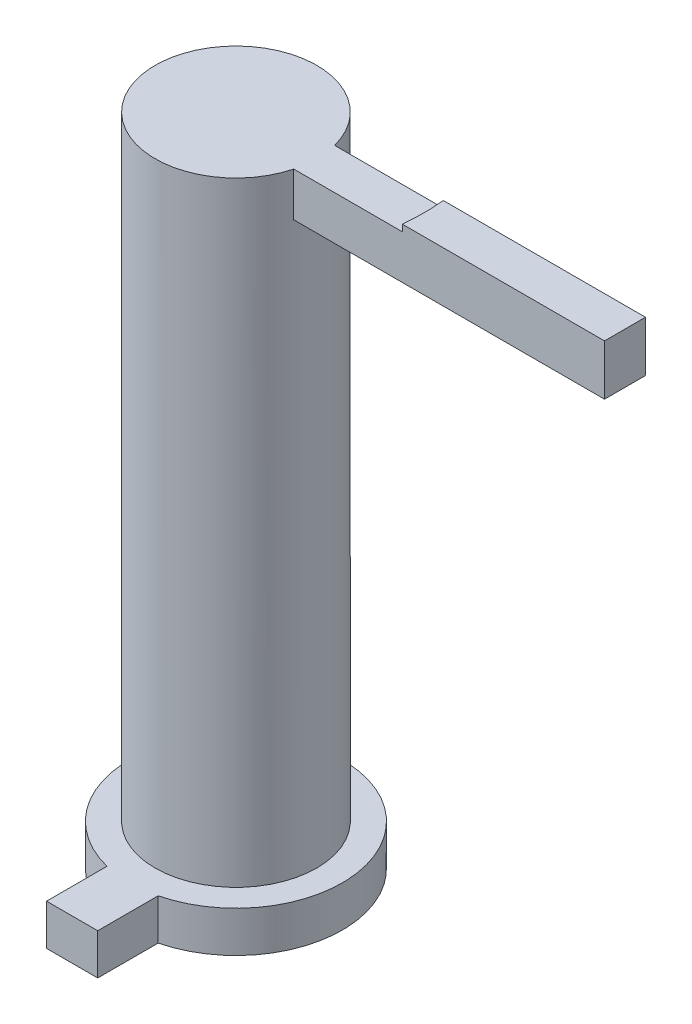
ISO-10303-21;
HEADER;
FILE_DESCRIPTION(('STEP AP214'),'2;1');
FILE_NAME('part.step','',(''),(''),'','','');
FILE_SCHEMA(('AUTOMOTIVE_DESIGN { 1 0 10303 214 1 1 1 1 }'));
ENDSEC;
DATA;
#1=APPLICATION_CONTEXT('core data for automotive mechanical design processes');
#2=APPLICATION_PROTOCOL_DEFINITION('international standard','automotive_design',2000,#1);
#3=PRODUCT_CONTEXT('',#1,'mechanical');
#4=PRODUCT('Part','Part','',(#3));
#5=PRODUCT_RELATED_PRODUCT_CATEGORY('part','',(#4));
#6=PRODUCT_DEFINITION_FORMATION('','',#4);
#7=PRODUCT_DEFINITION_CONTEXT('part definition',#1,'design');
#8=PRODUCT_DEFINITION('design','',#6,#7);
#9=PRODUCT_DEFINITION_SHAPE('','',#8);
#10=(LENGTH_UNIT() NAMED_UNIT(*) SI_UNIT(.MILLI.,.METRE.));
#11=(NAMED_UNIT(*) PLANE_ANGLE_UNIT() SI_UNIT($,.RADIAN.));
#12=(NAMED_UNIT(*) SI_UNIT($,.STERADIAN.) SOLID_ANGLE_UNIT());
#13=UNCERTAINTY_MEASURE_WITH_UNIT(LENGTH_MEASURE(1.E-05),#10,'distance_accuracy_value','');
#14=(GEOMETRIC_REPRESENTATION_CONTEXT(3) GLOBAL_UNCERTAINTY_ASSIGNED_CONTEXT((#13)) GLOBAL_UNIT_ASSIGNED_CONTEXT((#10,
#11,#12)) REPRESENTATION_CONTEXT('',''));
#15=CARTESIAN_POINT('',(0.,0.,0.));
#16=DIRECTION('',(0.,0.,1.));
#17=DIRECTION('',(1.,0.,0.));
#18=AXIS2_PLACEMENT_3D('',#15,#16,#17);
#19=CARTESIAN_POINT('',(0.,-2.,0.));
#20=DIRECTION('',(0.,1.,0.));
#21=DIRECTION('',(0.,0.,1.));
#22=AXIS2_PLACEMENT_3D('',#19,#20,#21);
#23=CYLINDRICAL_SURFACE('',#22,5.2);
#24=DIRECTION('',(0.,1.,0.));
#25=VECTOR('',#24,1.);
#26=CARTESIAN_POINT('',(-1.25,-2.,5.04752414555889));
#27=LINE('',#26,#25);
#28=CARTESIAN_POINT('',(-1.25,0.,5.04752414555889));
#29=VERTEX_POINT('',#28);
#30=CARTESIAN_POINT('',(-1.25,-2.,5.04752414555889));
#31=VERTEX_POINT('',#30);
#32=EDGE_CURVE('E144',#29,#31,#27,.F.);
#33=ORIENTED_EDGE('',*,*,#32,.F.);
#34=CARTESIAN_POINT('',(0.,0.,0.));
#35=DIRECTION('',(0.,-1.,0.));
#36=DIRECTION('',(0.,0.,-1.));
#37=AXIS2_PLACEMENT_3D('',#34,#35,#36);
#38=CIRCLE('',#37,5.2);
#39=CARTESIAN_POINT('',(1.25,0.,5.04752414555889));
#40=VERTEX_POINT('',#39);
#41=EDGE_CURVE('E212',#29,#40,#38,.T.);
#42=ORIENTED_EDGE('',*,*,#41,.T.);
#43=DIRECTION('',(0.,1.,0.));
#44=VECTOR('',#43,1.);
#45=CARTESIAN_POINT('',(1.25,-2.,5.04752414555889));
#46=LINE('',#45,#44);
#47=CARTESIAN_POINT('',(1.25,-2.,5.04752414555889));
#48=VERTEX_POINT('',#47);
#49=EDGE_CURVE('E66',#48,#40,#46,.T.);
#50=ORIENTED_EDGE('',*,*,#49,.F.);
#51=CARTESIAN_POINT('',(0.,-2.,0.));
#52=DIRECTION('',(0.,-1.,0.));
#53=DIRECTION('',(0.,0.,-1.));
#54=AXIS2_PLACEMENT_3D('',#51,#52,#53);
#55=CIRCLE('',#54,5.2);
#56=EDGE_CURVE('E61',#31,#48,#55,.T.);
#57=ORIENTED_EDGE('',*,*,#56,.F.);
#58=EDGE_LOOP('',(#33,#42,#50,#57));
#59=FACE_BOUND('',#58,.T.);
#60=ADVANCED_FACE('F45',(#59),#23,.T.);
#61=CARTESIAN_POINT('',(19.,30.3212763110894,1.));
#62=DIRECTION('',(0.,0.,-1.));
#63=DIRECTION('',(0.,1.,0.));
#64=AXIS2_PLACEMENT_3D('',#61,#62,#63);
#65=PLANE('',#64);
#66=DIRECTION('',(1.,0.,0.));
#67=VECTOR('',#66,1.);
#68=CARTESIAN_POINT('',(19.,30.,1.));
#69=LINE('',#68,#67);
#70=CARTESIAN_POINT('',(3.8213217608571,30.,1.));
#71=VERTEX_POINT('',#70);
#72=CARTESIAN_POINT('',(9.1230426918798,30.,1.));
#73=VERTEX_POINT('',#72);
#74=EDGE_CURVE('E167',#71,#73,#69,.T.);
#75=ORIENTED_EDGE('',*,*,#74,.F.);
#76=DIRECTION('',(0.,-1.,0.));
#77=VECTOR('',#76,1.);
#78=CARTESIAN_POINT('',(3.8213217608571,30.,1.));
#79=LINE('',#78,#77);
#80=CARTESIAN_POINT('',(3.8213217608571,27.8535586439345,1.));
#81=VERTEX_POINT('',#80);
#82=EDGE_CURVE('E209',#71,#81,#79,.T.);
#83=ORIENTED_EDGE('',*,*,#82,.T.);
#84=DIRECTION('',(-1.,0.,0.));
#85=VECTOR('',#84,1.);
#86=CARTESIAN_POINT('',(19.,27.8535586439345,1.));
#87=LINE('',#86,#85);
#88=CARTESIAN_POINT('',(19.,27.8535586439345,1.));
#89=VERTEX_POINT('',#88);
#90=EDGE_CURVE('E201',#89,#81,#87,.T.);
#91=ORIENTED_EDGE('',*,*,#90,.F.);
#92=DIRECTION('',(0.,-1.,0.));
#93=VECTOR('',#92,1.);
#94=CARTESIAN_POINT('',(19.,30.3212763110894,1.));
#95=LINE('',#94,#93);
#96=CARTESIAN_POINT('',(19.,30.3212763110894,1.));
#97=VERTEX_POINT('',#96);
#98=EDGE_CURVE('E176',#97,#89,#95,.T.);
#99=ORIENTED_EDGE('',*,*,#98,.F.);
#100=DIRECTION('',(-1.,0.,0.));
#101=VECTOR('',#100,1.);
#102=CARTESIAN_POINT('',(19.,30.3212763110894,1.));
#103=LINE('',#102,#101);
#104=CARTESIAN_POINT('',(9.12304269187981,30.3212763110894,1.));
#105=VERTEX_POINT('',#104);
#106=EDGE_CURVE('E189',#97,#105,#103,.T.);
#107=ORIENTED_EDGE('',*,*,#106,.T.);
#108=DIRECTION('',(0.,-1.,0.));
#109=VECTOR('',#108,1.);
#110=CARTESIAN_POINT('',(9.1230426918798,56.2796904318112,1.));
#111=LINE('',#110,#109);
#112=EDGE_CURVE('E173',#73,#105,#111,.F.);
#113=ORIENTED_EDGE('',*,*,#112,.F.);
#114=EDGE_LOOP('',(#75,#83,#91,#99,#107,#113));
#115=FACE_BOUND('',#114,.T.);
#116=ADVANCED_FACE('F242',(#115),#65,.F.);
#117=CARTESIAN_POINT('',(19.,30.3212763110894,-0.999999999999998));
#118=DIRECTION('',(0.,0.,1.));
#119=DIRECTION('',(0.,-1.,0.));
#120=AXIS2_PLACEMENT_3D('',#117,#118,#119);
#121=PLANE('',#120);
#122=DIRECTION('',(-1.,0.,0.));
#123=VECTOR('',#122,1.);
#124=CARTESIAN_POINT('',(19.,30.,-0.999999999999998));
#125=LINE('',#124,#123);
#126=CARTESIAN_POINT('',(9.12304269187981,30.,-0.999999999999996));
#127=VERTEX_POINT('',#126);
#128=CARTESIAN_POINT('',(3.8213217608571,30.,-0.999999999999998));
#129=VERTEX_POINT('',#128);
#130=EDGE_CURVE('E164',#127,#129,#125,.T.);
#131=ORIENTED_EDGE('',*,*,#130,.F.);
#132=DIRECTION('',(0.,-1.,0.));
#133=VECTOR('',#132,1.);
#134=CARTESIAN_POINT('',(9.12304269187981,56.2796904318112,-0.999999999999996));
#135=LINE('',#134,#133);
#136=CARTESIAN_POINT('',(9.12304269187981,30.3212763110894,-0.999999999999998));
#137=VERTEX_POINT('',#136);
#138=EDGE_CURVE('E170',#137,#127,#135,.T.);
#139=ORIENTED_EDGE('',*,*,#138,.F.);
#140=DIRECTION('',(-1.,0.,0.));
#141=VECTOR('',#140,1.);
#142=CARTESIAN_POINT('',(19.,30.3212763110894,-0.999999999999998));
#143=LINE('',#142,#141);
#144=CARTESIAN_POINT('',(19.,30.3212763110894,-0.999999999999998));
#145=VERTEX_POINT('',#144);
#146=EDGE_CURVE('E193',#145,#137,#143,.T.);
#147=ORIENTED_EDGE('',*,*,#146,.F.);
#148=DIRECTION('',(0.,1.,0.));
#149=VECTOR('',#148,1.);
#150=CARTESIAN_POINT('',(19.,30.3212763110894,-0.999999999999998));
#151=LINE('',#150,#149);
#152=CARTESIAN_POINT('',(19.,27.8535586439345,-0.999999999999999));
#153=VERTEX_POINT('',#152);
#154=EDGE_CURVE('E183',#153,#145,#151,.T.);
#155=ORIENTED_EDGE('',*,*,#154,.F.);
#156=DIRECTION('',(-1.,0.,0.));
#157=VECTOR('',#156,1.);
#158=CARTESIAN_POINT('',(19.,27.8535586439345,-0.999999999999999));
#159=LINE('',#158,#157);
#160=CARTESIAN_POINT('',(3.8213217608571,27.8535586439345,-0.999999999999999));
#161=VERTEX_POINT('',#160);
#162=EDGE_CURVE('E197',#153,#161,#159,.T.);
#163=ORIENTED_EDGE('',*,*,#162,.T.);
#164=DIRECTION('',(0.,-1.,0.));
#165=VECTOR('',#164,1.);
#166=CARTESIAN_POINT('',(3.8213217608571,30.,-0.999999999999998));
#167=LINE('',#166,#165);
#168=EDGE_CURVE('E205',#161,#129,#167,.F.);
#169=ORIENTED_EDGE('',*,*,#168,.T.);
#170=EDGE_LOOP('',(#131,#139,#147,#155,#163,#169));
#171=FACE_BOUND('',#170,.T.);
#172=ADVANCED_FACE('F246',(#171),#121,.F.);
#173=CARTESIAN_POINT('',(0.,30.,0.));
#174=DIRECTION('',(0.,-1.,0.));
#175=DIRECTION('',(0.,0.,-1.));
#176=AXIS2_PLACEMENT_3D('',#173,#174,#175);
#177=CYLINDRICAL_SURFACE('',#176,3.95);
#178=CARTESIAN_POINT('',(0.,0.,0.));
#179=DIRECTION('',(0.,1.,0.));
#180=DIRECTION('',(0.,0.,1.));
#181=AXIS2_PLACEMENT_3D('',#178,#179,#180);
#182=CIRCLE('',#181,3.95);
#183=CARTESIAN_POINT('',(0.,0.,3.95));
#184=VERTEX_POINT('',#183);
#185=EDGE_CURVE('E215',#184,#184,#182,.T.);
#186=ORIENTED_EDGE('',*,*,#185,.T.);
#187=EDGE_LOOP('',(#186));
#188=FACE_BOUND('',#187,.T.);
#189=ORIENTED_EDGE('',*,*,#82,.F.);
#190=CARTESIAN_POINT('',(0.,30.,0.));
#191=DIRECTION('',(0.,1.,0.));
#192=DIRECTION('',(0.,0.,1.));
#193=AXIS2_PLACEMENT_3D('',#190,#191,#192);
#194=CIRCLE('',#193,3.95);
#195=EDGE_CURVE('E54',#129,#71,#194,.T.);
#196=ORIENTED_EDGE('',*,*,#195,.F.);
#197=ORIENTED_EDGE('',*,*,#168,.F.);
#198=CARTESIAN_POINT('',(0.,27.8535586439345,0.));
#199=DIRECTION('',(0.,1.,0.));
#200=DIRECTION('',(0.,0.,1.));
#201=AXIS2_PLACEMENT_3D('',#198,#199,#200);
#202=CIRCLE('',#201,3.95);
#203=EDGE_CURVE('E11',#81,#161,#202,.T.);
#204=ORIENTED_EDGE('',*,*,#203,.F.);
#205=EDGE_LOOP('',(#189,#196,#197,#204));
#206=FACE_BOUND('',#205,.T.);
#207=ADVANCED_FACE('F47',(#188,#206),#177,.T.);
#208=CARTESIAN_POINT('',(0.,30.,0.));
#209=DIRECTION('',(0.,1.,0.));
#210=DIRECTION('',(0.,0.,1.));
#211=AXIS2_PLACEMENT_3D('',#208,#209,#210);
#212=PLANE('',#211);
#213=ORIENTED_EDGE('',*,*,#130,.T.);
#214=ORIENTED_EDGE('',*,*,#195,.T.);
#215=ORIENTED_EDGE('',*,*,#74,.T.);
#216=CARTESIAN_POINT('',(0.,30.,0.));
#217=DIRECTION('',(0.,1.,0.));
#218=DIRECTION('',(0.,0.,1.));
#219=AXIS2_PLACEMENT_3D('',#216,#217,#218);
#220=CIRCLE('',#219,9.17768532680553);
#221=EDGE_CURVE('E156',#73,#127,#220,.T.);
#222=ORIENTED_EDGE('',*,*,#221,.T.);
#223=EDGE_LOOP('',(#213,#214,#215,#222));
#224=FACE_BOUND('',#223,.T.);
#225=ADVANCED_FACE('F238',(#224),#212,.T.);
#226=CARTESIAN_POINT('',(0.,-2.,0.));
#227=DIRECTION('',(0.,-1.,0.));
#228=DIRECTION('',(0.,0.,-1.));
#229=AXIS2_PLACEMENT_3D('',#226,#227,#228);
#230=PLANE('',#229);
#231=ORIENTED_EDGE('',*,*,#56,.T.);
#232=DIRECTION('',(0.,0.,-1.));
#233=VECTOR('',#232,1.);
#234=CARTESIAN_POINT('',(1.25,-2.,8.));
#235=LINE('',#234,#233);
#236=CARTESIAN_POINT('',(1.25,-2.,8.));
#237=VERTEX_POINT('',#236);
#238=EDGE_CURVE('E127',#237,#48,#235,.T.);
#239=ORIENTED_EDGE('',*,*,#238,.F.);
#240=DIRECTION('',(1.,0.,0.));
#241=VECTOR('',#240,1.);
#242=CARTESIAN_POINT('',(-1.25,-2.,8.));
#243=LINE('',#242,#241);
#244=CARTESIAN_POINT('',(-1.25,-2.,8.));
#245=VERTEX_POINT('',#244);
#246=EDGE_CURVE('E121',#245,#237,#243,.T.);
#247=ORIENTED_EDGE('',*,*,#246,.F.);
#248=DIRECTION('',(0.,0.,-1.));
#249=VECTOR('',#248,1.);
#250=CARTESIAN_POINT('',(-1.25,-2.,8.));
#251=LINE('',#250,#249);
#252=EDGE_CURVE('E125',#245,#31,#251,.T.);
#253=ORIENTED_EDGE('',*,*,#252,.T.);
#254=EDGE_LOOP('',(#231,#239,#247,#253));
#255=FACE_BOUND('',#254,.T.);
#256=ADVANCED_FACE('F123',(#255),#230,.T.);
#257=CARTESIAN_POINT('',(0.,0.,0.));
#258=DIRECTION('',(0.,-1.,0.));
#259=DIRECTION('',(0.,0.,-1.));
#260=AXIS2_PLACEMENT_3D('',#257,#258,#259);
#261=PLANE('',#260);
#262=ORIENTED_EDGE('',*,*,#41,.F.);
#263=DIRECTION('',(0.,0.,-1.));
#264=VECTOR('',#263,1.);
#265=CARTESIAN_POINT('',(-1.25,0.,8.));
#266=LINE('',#265,#264);
#267=CARTESIAN_POINT('',(-1.25,0.,8.));
#268=VERTEX_POINT('',#267);
#269=EDGE_CURVE('E411',#268,#29,#266,.T.);
#270=ORIENTED_EDGE('',*,*,#269,.F.);
#271=DIRECTION('',(-1.,0.,0.));
#272=VECTOR('',#271,1.);
#273=CARTESIAN_POINT('',(-1.25,0.,8.));
#274=LINE('',#273,#272);
#275=CARTESIAN_POINT('',(1.25,0.,8.));
#276=VERTEX_POINT('',#275);
#277=EDGE_CURVE('E137',#276,#268,#274,.T.);
#278=ORIENTED_EDGE('',*,*,#277,.F.);
#279=DIRECTION('',(0.,0.,-1.));
#280=VECTOR('',#279,1.);
#281=CARTESIAN_POINT('',(1.25,0.,8.));
#282=LINE('',#281,#280);
#283=EDGE_CURVE('E150',#276,#40,#282,.T.);
#284=ORIENTED_EDGE('',*,*,#283,.T.);
#285=EDGE_LOOP('',(#262,#270,#278,#284));
#286=FACE_BOUND('',#285,.T.);
#287=ORIENTED_EDGE('',*,*,#185,.F.);
#288=EDGE_LOOP('',(#287));
#289=FACE_BOUND('',#288,.T.);
#290=ADVANCED_FACE('F226',(#286,#289),#261,.F.);
#291=CARTESIAN_POINT('',(19.,27.8535586439345,1.));
#292=DIRECTION('',(0.,1.,0.));
#293=DIRECTION('',(0.,0.,1.));
#294=AXIS2_PLACEMENT_3D('',#291,#292,#293);
#295=PLANE('',#294);
#296=ORIENTED_EDGE('',*,*,#90,.T.);
#297=ORIENTED_EDGE('',*,*,#203,.T.);
#298=ORIENTED_EDGE('',*,*,#162,.F.);
#299=DIRECTION('',(0.,0.,-1.));
#300=VECTOR('',#299,1.);
#301=CARTESIAN_POINT('',(19.,27.8535586439345,1.));
#302=LINE('',#301,#300);
#303=EDGE_CURVE('E180',#89,#153,#302,.T.);
#304=ORIENTED_EDGE('',*,*,#303,.F.);
#305=EDGE_LOOP('',(#296,#297,#298,#304));
#306=FACE_BOUND('',#305,.T.);
#307=ADVANCED_FACE('F228',(#306),#295,.F.);
#308=CARTESIAN_POINT('',(19.,30.3212763110894,1.));
#309=DIRECTION('',(0.,-1.,0.));
#310=DIRECTION('',(0.,0.,-1.));
#311=AXIS2_PLACEMENT_3D('',#308,#309,#310);
#312=PLANE('',#311);
#313=CARTESIAN_POINT('',(0.,30.3212763110894,0.));
#314=DIRECTION('',(0.,-1.,0.));
#315=DIRECTION('',(0.,0.,-1.));
#316=AXIS2_PLACEMENT_3D('',#313,#314,#315);
#317=CIRCLE('',#316,9.17768532680553);
#318=EDGE_CURVE('E160',#137,#105,#317,.T.);
#319=ORIENTED_EDGE('',*,*,#318,.T.);
#320=ORIENTED_EDGE('',*,*,#106,.F.);
#321=DIRECTION('',(0.,0.,1.));
#322=VECTOR('',#321,1.);
#323=CARTESIAN_POINT('',(19.,30.3212763110894,1.));
#324=LINE('',#323,#322);
#325=EDGE_CURVE('E186',#145,#97,#324,.T.);
#326=ORIENTED_EDGE('',*,*,#325,.F.);
#327=ORIENTED_EDGE('',*,*,#146,.T.);
#328=EDGE_LOOP('',(#319,#320,#326,#327));
#329=FACE_BOUND('',#328,.T.);
#330=ADVANCED_FACE('F235',(#329),#312,.F.);
#331=CARTESIAN_POINT('',(19.,0.,0.));
#332=DIRECTION('',(1.,0.,0.));
#333=DIRECTION('',(0.,0.,-1.));
#334=AXIS2_PLACEMENT_3D('',#331,#332,#333);
#335=PLANE('',#334);
#336=ORIENTED_EDGE('',*,*,#98,.T.);
#337=ORIENTED_EDGE('',*,*,#303,.T.);
#338=ORIENTED_EDGE('',*,*,#154,.T.);
#339=ORIENTED_EDGE('',*,*,#325,.T.);
#340=EDGE_LOOP('',(#336,#337,#338,#339));
#341=FACE_BOUND('',#340,.T.);
#342=ADVANCED_FACE('F268',(#341),#335,.T.);
#343=CARTESIAN_POINT('',(0.,56.2796904318112,0.));
#344=DIRECTION('',(0.,-1.,0.));
#345=DIRECTION('',(0.,0.,-1.));
#346=AXIS2_PLACEMENT_3D('',#343,#344,#345);
#347=CYLINDRICAL_SURFACE('',#346,9.17768532680553);
#348=ORIENTED_EDGE('',*,*,#112,.T.);
#349=ORIENTED_EDGE('',*,*,#318,.F.);
#350=ORIENTED_EDGE('',*,*,#138,.T.);
#351=ORIENTED_EDGE('',*,*,#221,.F.);
#352=EDGE_LOOP('',(#348,#349,#350,#351));
#353=FACE_BOUND('',#352,.T.);
#354=ADVANCED_FACE('F274',(#353),#347,.F.);
#355=CARTESIAN_POINT('',(-1.25,0.,8.));
#356=DIRECTION('',(1.,0.,0.));
#357=DIRECTION('',(0.,1.,0.));
#358=AXIS2_PLACEMENT_3D('',#355,#356,#357);
#359=PLANE('',#358);
#360=ORIENTED_EDGE('',*,*,#269,.T.);
#361=ORIENTED_EDGE('',*,*,#32,.T.);
#362=ORIENTED_EDGE('',*,*,#252,.F.);
#363=DIRECTION('',(0.,-1.,0.));
#364=VECTOR('',#363,1.);
#365=CARTESIAN_POINT('',(-1.25,0.,8.));
#366=LINE('',#365,#364);
#367=EDGE_CURVE('E132',#268,#245,#366,.T.);
#368=ORIENTED_EDGE('',*,*,#367,.F.);
#369=EDGE_LOOP('',(#360,#361,#362,#368));
#370=FACE_BOUND('',#369,.T.);
#371=ADVANCED_FACE('F143',(#370),#359,.F.);
#372=CARTESIAN_POINT('',(1.25,0.,8.));
#373=DIRECTION('',(-1.,0.,0.));
#374=DIRECTION('',(0.,-1.,0.));
#375=AXIS2_PLACEMENT_3D('',#372,#373,#374);
#376=PLANE('',#375);
#377=ORIENTED_EDGE('',*,*,#238,.T.);
#378=ORIENTED_EDGE('',*,*,#49,.T.);
#379=ORIENTED_EDGE('',*,*,#283,.F.);
#380=DIRECTION('',(0.,1.,0.));
#381=VECTOR('',#380,1.);
#382=CARTESIAN_POINT('',(1.25,0.,8.));
#383=LINE('',#382,#381);
#384=EDGE_CURVE('E131',#237,#276,#383,.T.);
#385=ORIENTED_EDGE('',*,*,#384,.F.);
#386=EDGE_LOOP('',(#377,#378,#379,#385));
#387=FACE_BOUND('',#386,.T.);
#388=ADVANCED_FACE('F281',(#387),#376,.F.);
#389=CARTESIAN_POINT('',(0.,0.,8.));
#390=DIRECTION('',(0.,0.,1.));
#391=DIRECTION('',(1.,0.,0.));
#392=AXIS2_PLACEMENT_3D('',#389,#390,#391);
#393=PLANE('',#392);
#394=ORIENTED_EDGE('',*,*,#367,.T.);
#395=ORIENTED_EDGE('',*,*,#246,.T.);
#396=ORIENTED_EDGE('',*,*,#384,.T.);
#397=ORIENTED_EDGE('',*,*,#277,.T.);
#398=EDGE_LOOP('',(#394,#395,#396,#397));
#399=FACE_BOUND('',#398,.T.);
#400=ADVANCED_FACE('F135',(#399),#393,.T.);
#401=CLOSED_SHELL('',(#60,#116,#172,#207,#225,#256,#290,#307,#330,#342,#354,#371,#388,#400));
#402=MANIFOLD_SOLID_BREP('B2',#401);
#403=ADVANCED_BREP_SHAPE_REPRESENTATION('',(#18,#402),#14);
#404=SHAPE_DEFINITION_REPRESENTATION(#9,#403);
ENDSEC;
END-ISO-10303-21;
